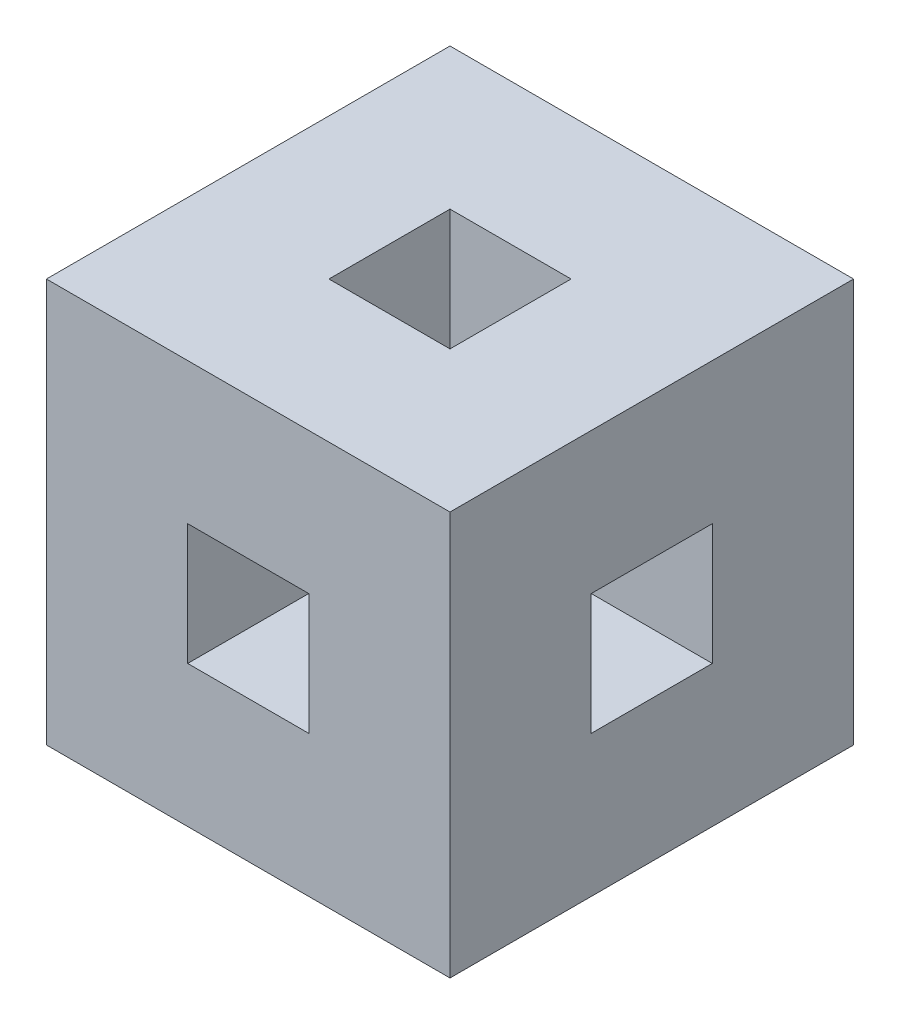
ISO-10303-21;
HEADER;
FILE_DESCRIPTION(('STEP AP214'),'2;1');
FILE_NAME('part.step','',(''),(''),'','','');
FILE_SCHEMA(('AUTOMOTIVE_DESIGN { 1 0 10303 214 1 1 1 1 }'));
ENDSEC;
DATA;
#1=APPLICATION_CONTEXT('core data for automotive mechanical design processes');
#2=APPLICATION_PROTOCOL_DEFINITION('international standard','automotive_design',2000,#1);
#3=PRODUCT_CONTEXT('',#1,'mechanical');
#4=PRODUCT('Part','Part','',(#3));
#5=PRODUCT_RELATED_PRODUCT_CATEGORY('part','',(#4));
#6=PRODUCT_DEFINITION_FORMATION('','',#4);
#7=PRODUCT_DEFINITION_CONTEXT('part definition',#1,'design');
#8=PRODUCT_DEFINITION('design','',#6,#7);
#9=PRODUCT_DEFINITION_SHAPE('','',#8);
#10=(LENGTH_UNIT() NAMED_UNIT(*) SI_UNIT(.MILLI.,.METRE.));
#11=(NAMED_UNIT(*) PLANE_ANGLE_UNIT() SI_UNIT($,.RADIAN.));
#12=(NAMED_UNIT(*) SI_UNIT($,.STERADIAN.) SOLID_ANGLE_UNIT());
#13=UNCERTAINTY_MEASURE_WITH_UNIT(LENGTH_MEASURE(1.E-05),#10,'distance_accuracy_value','');
#14=(GEOMETRIC_REPRESENTATION_CONTEXT(3) GLOBAL_UNCERTAINTY_ASSIGNED_CONTEXT((#13)) GLOBAL_UNIT_ASSIGNED_CONTEXT((#10,
#11,#12)) REPRESENTATION_CONTEXT('',''));
#15=CARTESIAN_POINT('',(0.,0.,0.));
#16=DIRECTION('',(0.,0.,1.));
#17=DIRECTION('',(1.,0.,0.));
#18=AXIS2_PLACEMENT_3D('',#15,#16,#17);
#19=CARTESIAN_POINT('',(0.,50.,0.));
#20=DIRECTION('',(0.,-1.,0.));
#21=DIRECTION('',(0.,0.,-1.));
#22=AXIS2_PLACEMENT_3D('',#19,#20,#21);
#23=PLANE('',#22);
#24=DIRECTION('',(0.,0.,-1.));
#25=VECTOR('',#24,1.);
#26=CARTESIAN_POINT('',(25.,50.,25.));
#27=LINE('',#26,#25);
#28=CARTESIAN_POINT('',(25.,50.,25.));
#29=VERTEX_POINT('',#28);
#30=CARTESIAN_POINT('',(25.,50.,-25.));
#31=VERTEX_POINT('',#30);
#32=EDGE_CURVE('E365',#29,#31,#27,.T.);
#33=ORIENTED_EDGE('',*,*,#32,.T.);
#34=DIRECTION('',(-1.,0.,0.));
#35=VECTOR('',#34,1.);
#36=CARTESIAN_POINT('',(-25.,50.,-25.));
#37=LINE('',#36,#35);
#38=CARTESIAN_POINT('',(-25.,50.,-25.));
#39=VERTEX_POINT('',#38);
#40=EDGE_CURVE('E366',#31,#39,#37,.T.);
#41=ORIENTED_EDGE('',*,*,#40,.T.);
#42=DIRECTION('',(0.,0.,1.));
#43=VECTOR('',#42,1.);
#44=CARTESIAN_POINT('',(-25.,50.,25.));
#45=LINE('',#44,#43);
#46=CARTESIAN_POINT('',(-25.,50.,25.));
#47=VERTEX_POINT('',#46);
#48=EDGE_CURVE('E375',#39,#47,#45,.T.);
#49=ORIENTED_EDGE('',*,*,#48,.T.);
#50=DIRECTION('',(1.,0.,0.));
#51=VECTOR('',#50,1.);
#52=CARTESIAN_POINT('',(-25.,50.,25.));
#53=LINE('',#52,#51);
#54=EDGE_CURVE('E374',#47,#29,#53,.T.);
#55=ORIENTED_EDGE('',*,*,#54,.T.);
#56=EDGE_LOOP('',(#33,#41,#49,#55));
#57=FACE_BOUND('',#56,.T.);
#58=DIRECTION('',(0.,0.,-1.));
#59=VECTOR('',#58,1.);
#60=CARTESIAN_POINT('',(-7.49999999999999,50.,7.49999999999982));
#61=LINE('',#60,#59);
#62=CARTESIAN_POINT('',(-7.49999999999999,50.,7.49999999999982));
#63=VERTEX_POINT('',#62);
#64=CARTESIAN_POINT('',(-7.49999999999999,50.,-7.50000000000018));
#65=VERTEX_POINT('',#64);
#66=EDGE_CURVE('E62',#63,#65,#61,.T.);
#67=ORIENTED_EDGE('',*,*,#66,.T.);
#68=DIRECTION('',(1.,0.,0.));
#69=VECTOR('',#68,1.);
#70=CARTESIAN_POINT('',(-7.49999999999999,50.,-7.50000000000018));
#71=LINE('',#70,#69);
#72=CARTESIAN_POINT('',(7.50000000000001,50.,-7.50000000000018));
#73=VERTEX_POINT('',#72);
#74=EDGE_CURVE('E219',#65,#73,#71,.T.);
#75=ORIENTED_EDGE('',*,*,#74,.T.);
#76=DIRECTION('',(0.,0.,-1.));
#77=VECTOR('',#76,1.);
#78=CARTESIAN_POINT('',(7.50000000000001,50.,7.49999999999982));
#79=LINE('',#78,#77);
#80=CARTESIAN_POINT('',(7.50000000000001,50.,7.49999999999982));
#81=VERTEX_POINT('',#80);
#82=EDGE_CURVE('E221',#81,#73,#79,.T.);
#83=ORIENTED_EDGE('',*,*,#82,.F.);
#84=DIRECTION('',(1.,0.,0.));
#85=VECTOR('',#84,1.);
#86=CARTESIAN_POINT('',(-7.49999999999999,50.,7.49999999999982));
#87=LINE('',#86,#85);
#88=EDGE_CURVE('E196',#63,#81,#87,.T.);
#89=ORIENTED_EDGE('',*,*,#88,.F.);
#90=EDGE_LOOP('',(#67,#75,#83,#89));
#91=FACE_BOUND('',#90,.T.);
#92=ADVANCED_FACE('F44',(#57,#91),#23,.F.);
#93=CARTESIAN_POINT('',(0.,0.,0.));
#94=DIRECTION('',(0.,-1.,0.));
#95=DIRECTION('',(0.,0.,-1.));
#96=AXIS2_PLACEMENT_3D('',#93,#94,#95);
#97=PLANE('',#96);
#98=DIRECTION('',(0.,0.,-1.));
#99=VECTOR('',#98,1.);
#100=CARTESIAN_POINT('',(25.,0.,25.));
#101=LINE('',#100,#99);
#102=CARTESIAN_POINT('',(25.,0.,25.));
#103=VERTEX_POINT('',#102);
#104=CARTESIAN_POINT('',(25.,0.,-25.));
#105=VERTEX_POINT('',#104);
#106=EDGE_CURVE('E361',#103,#105,#101,.T.);
#107=ORIENTED_EDGE('',*,*,#106,.F.);
#108=DIRECTION('',(1.,0.,0.));
#109=VECTOR('',#108,1.);
#110=CARTESIAN_POINT('',(-25.,0.,25.));
#111=LINE('',#110,#109);
#112=CARTESIAN_POINT('',(-25.,0.,25.));
#113=VERTEX_POINT('',#112);
#114=EDGE_CURVE('E369',#113,#103,#111,.T.);
#115=ORIENTED_EDGE('',*,*,#114,.F.);
#116=DIRECTION('',(0.,0.,1.));
#117=VECTOR('',#116,1.);
#118=CARTESIAN_POINT('',(-25.,0.,25.));
#119=LINE('',#118,#117);
#120=CARTESIAN_POINT('',(-25.,0.,-25.));
#121=VERTEX_POINT('',#120);
#122=EDGE_CURVE('E384',#121,#113,#119,.T.);
#123=ORIENTED_EDGE('',*,*,#122,.F.);
#124=DIRECTION('',(-1.,0.,0.));
#125=VECTOR('',#124,1.);
#126=CARTESIAN_POINT('',(-25.,0.,-25.));
#127=LINE('',#126,#125);
#128=EDGE_CURVE('E385',#105,#121,#127,.T.);
#129=ORIENTED_EDGE('',*,*,#128,.F.);
#130=EDGE_LOOP('',(#107,#115,#123,#129));
#131=FACE_BOUND('',#130,.T.);
#132=DIRECTION('',(1.,0.,0.));
#133=VECTOR('',#132,1.);
#134=CARTESIAN_POINT('',(-7.49999999999999,0.,-7.50000000000018));
#135=LINE('',#134,#133);
#136=CARTESIAN_POINT('',(-7.49999999999999,0.,-7.50000000000018));
#137=VERTEX_POINT('',#136);
#138=CARTESIAN_POINT('',(7.50000000000001,0.,-7.50000000000018));
#139=VERTEX_POINT('',#138);
#140=EDGE_CURVE('E197',#137,#139,#135,.T.);
#141=ORIENTED_EDGE('',*,*,#140,.F.);
#142=DIRECTION('',(0.,0.,-1.));
#143=VECTOR('',#142,1.);
#144=CARTESIAN_POINT('',(-7.49999999999999,0.,7.49999999999982));
#145=LINE('',#144,#143);
#146=CARTESIAN_POINT('',(-7.49999999999999,0.,7.49999999999982));
#147=VERTEX_POINT('',#146);
#148=EDGE_CURVE('E187',#147,#137,#145,.T.);
#149=ORIENTED_EDGE('',*,*,#148,.F.);
#150=DIRECTION('',(1.,0.,0.));
#151=VECTOR('',#150,1.);
#152=CARTESIAN_POINT('',(-7.49999999999999,0.,7.49999999999982));
#153=LINE('',#152,#151);
#154=CARTESIAN_POINT('',(7.50000000000001,0.,7.49999999999982));
#155=VERTEX_POINT('',#154);
#156=EDGE_CURVE('E215',#147,#155,#153,.T.);
#157=ORIENTED_EDGE('',*,*,#156,.T.);
#158=DIRECTION('',(0.,0.,-1.));
#159=VECTOR('',#158,1.);
#160=CARTESIAN_POINT('',(7.50000000000001,0.,7.49999999999982));
#161=LINE('',#160,#159);
#162=EDGE_CURVE('E66',#155,#139,#161,.T.);
#163=ORIENTED_EDGE('',*,*,#162,.T.);
#164=EDGE_LOOP('',(#141,#149,#157,#163));
#165=FACE_BOUND('',#164,.T.);
#166=ADVANCED_FACE('F208',(#131,#165),#97,.T.);
#167=CARTESIAN_POINT('',(-7.49999999999999,32.5,-25.));
#168=DIRECTION('',(0.,-1.,0.));
#169=DIRECTION('',(0.,0.,-1.));
#170=AXIS2_PLACEMENT_3D('',#167,#168,#169);
#171=PLANE('',#170);
#172=DIRECTION('',(1.,0.,0.));
#173=VECTOR('',#172,1.);
#174=CARTESIAN_POINT('',(-25.,32.5,-7.5));
#175=LINE('',#174,#173);
#176=CARTESIAN_POINT('',(-25.,32.5,-7.5));
#177=VERTEX_POINT('',#176);
#178=CARTESIAN_POINT('',(-7.49999999999999,32.5,-7.50000000000018));
#179=VERTEX_POINT('',#178);
#180=EDGE_CURVE('E297',#177,#179,#175,.T.);
#181=ORIENTED_EDGE('',*,*,#180,.T.);
#182=DIRECTION('',(0.,0.,1.));
#183=VECTOR('',#182,1.);
#184=CARTESIAN_POINT('',(-7.49999999999999,32.5,-25.));
#185=LINE('',#184,#183);
#186=CARTESIAN_POINT('',(-7.49999999999999,32.5,7.49999999999982));
#187=VERTEX_POINT('',#186);
#188=EDGE_CURVE('E253',#179,#187,#185,.T.);
#189=ORIENTED_EDGE('',*,*,#188,.T.);
#190=DIRECTION('',(1.,0.,0.));
#191=VECTOR('',#190,1.);
#192=CARTESIAN_POINT('',(-25.,32.5,7.5));
#193=LINE('',#192,#191);
#194=CARTESIAN_POINT('',(-25.,32.5,7.5));
#195=VERTEX_POINT('',#194);
#196=EDGE_CURVE('E302',#195,#187,#193,.T.);
#197=ORIENTED_EDGE('',*,*,#196,.F.);
#198=DIRECTION('',(0.,0.,-1.));
#199=VECTOR('',#198,1.);
#200=CARTESIAN_POINT('',(-25.,32.5,7.5));
#201=LINE('',#200,#199);
#202=EDGE_CURVE('E259',#195,#177,#201,.T.);
#203=ORIENTED_EDGE('',*,*,#202,.T.);
#204=EDGE_LOOP('',(#181,#189,#197,#203));
#205=FACE_BOUND('',#204,.T.);
#206=ADVANCED_FACE('F483',(#205),#171,.T.);
#207=DIRECTION('',(0.,0.,1.));
#208=VECTOR('',#207,1.);
#209=CARTESIAN_POINT('',(7.50000000000001,32.5,-25.));
#210=LINE('',#209,#208);
#211=CARTESIAN_POINT('',(7.50000000000001,32.5,-25.));
#212=VERTEX_POINT('',#211);
#213=CARTESIAN_POINT('',(7.50000000000001,32.5,-7.50000000000018));
#214=VERTEX_POINT('',#213);
#215=EDGE_CURVE('E356',#212,#214,#210,.T.);
#216=ORIENTED_EDGE('',*,*,#215,.T.);
#217=DIRECTION('',(-1.,0.,0.));
#218=VECTOR('',#217,1.);
#219=CARTESIAN_POINT('',(-7.49999999999999,32.5,-7.50000000000018));
#220=LINE('',#219,#218);
#221=EDGE_CURVE('E249',#214,#179,#220,.T.);
#222=ORIENTED_EDGE('',*,*,#221,.T.);
#223=DIRECTION('',(0.,0.,1.));
#224=VECTOR('',#223,1.);
#225=CARTESIAN_POINT('',(-7.49999999999999,32.5,-25.));
#226=LINE('',#225,#224);
#227=CARTESIAN_POINT('',(-7.49999999999999,32.5,-25.));
#228=VERTEX_POINT('',#227);
#229=EDGE_CURVE('E341',#228,#179,#226,.T.);
#230=ORIENTED_EDGE('',*,*,#229,.F.);
#231=DIRECTION('',(1.,0.,0.));
#232=VECTOR('',#231,1.);
#233=CARTESIAN_POINT('',(-7.49999999999999,32.5,-25.));
#234=LINE('',#233,#232);
#235=EDGE_CURVE('E314',#228,#212,#234,.T.);
#236=ORIENTED_EDGE('',*,*,#235,.T.);
#237=EDGE_LOOP('',(#216,#222,#230,#236));
#238=FACE_BOUND('',#237,.T.);
#239=ADVANCED_FACE('F491',(#238),#171,.T.);
#240=DIRECTION('',(0.,0.,1.));
#241=VECTOR('',#240,1.);
#242=CARTESIAN_POINT('',(7.50000000000001,32.5,-25.));
#243=LINE('',#242,#241);
#244=CARTESIAN_POINT('',(7.50000000000001,32.5,7.5));
#245=VERTEX_POINT('',#244);
#246=EDGE_CURVE('E244',#214,#245,#243,.T.);
#247=ORIENTED_EDGE('',*,*,#246,.F.);
#248=CARTESIAN_POINT('',(25.,32.5,-7.5));
#249=VERTEX_POINT('',#248);
#250=EDGE_CURVE('E293',#214,#249,#175,.T.);
#251=ORIENTED_EDGE('',*,*,#250,.T.);
#252=DIRECTION('',(0.,0.,-1.));
#253=VECTOR('',#252,1.);
#254=CARTESIAN_POINT('',(25.,32.5,7.5));
#255=LINE('',#254,#253);
#256=CARTESIAN_POINT('',(25.,32.5,7.5));
#257=VERTEX_POINT('',#256);
#258=EDGE_CURVE('E274',#257,#249,#255,.T.);
#259=ORIENTED_EDGE('',*,*,#258,.F.);
#260=EDGE_CURVE('E298',#245,#257,#193,.T.);
#261=ORIENTED_EDGE('',*,*,#260,.F.);
#262=EDGE_LOOP('',(#247,#251,#259,#261));
#263=FACE_BOUND('',#262,.T.);
#264=ADVANCED_FACE('F458',(#263),#171,.T.);
#265=CARTESIAN_POINT('',(-7.49999999999999,17.5,-25.));
#266=DIRECTION('',(0.,-1.,0.));
#267=DIRECTION('',(0.,0.,-1.));
#268=AXIS2_PLACEMENT_3D('',#265,#266,#267);
#269=PLANE('',#268);
#270=DIRECTION('',(0.,0.,1.));
#271=VECTOR('',#270,1.);
#272=CARTESIAN_POINT('',(-7.49999999999999,17.5,-25.));
#273=LINE('',#272,#271);
#274=CARTESIAN_POINT('',(-7.49999999999999,17.5,-7.50000000000018));
#275=VERTEX_POINT('',#274);
#276=CARTESIAN_POINT('',(-7.49999999999999,17.5,7.5));
#277=VERTEX_POINT('',#276);
#278=EDGE_CURVE('E11',#275,#277,#273,.T.);
#279=ORIENTED_EDGE('',*,*,#278,.F.);
#280=DIRECTION('',(1.,0.,0.));
#281=VECTOR('',#280,1.);
#282=CARTESIAN_POINT('',(-25.,17.5,-7.5));
#283=LINE('',#282,#281);
#284=CARTESIAN_POINT('',(-25.,17.5,-7.5));
#285=VERTEX_POINT('',#284);
#286=EDGE_CURVE('E292',#285,#275,#283,.T.);
#287=ORIENTED_EDGE('',*,*,#286,.F.);
#288=DIRECTION('',(0.,0.,-1.));
#289=VECTOR('',#288,1.);
#290=CARTESIAN_POINT('',(-25.,17.5,7.5));
#291=LINE('',#290,#289);
#292=CARTESIAN_POINT('',(-25.,17.5,7.5));
#293=VERTEX_POINT('',#292);
#294=EDGE_CURVE('E270',#293,#285,#291,.T.);
#295=ORIENTED_EDGE('',*,*,#294,.F.);
#296=DIRECTION('',(1.,0.,0.));
#297=VECTOR('',#296,1.);
#298=CARTESIAN_POINT('',(-25.,17.5,7.5));
#299=LINE('',#298,#297);
#300=EDGE_CURVE('E287',#293,#277,#299,.T.);
#301=ORIENTED_EDGE('',*,*,#300,.T.);
#302=EDGE_LOOP('',(#279,#287,#295,#301));
#303=FACE_BOUND('',#302,.T.);
#304=ADVANCED_FACE('F478',(#303),#269,.F.);
#305=DIRECTION('',(-1.,0.,0.));
#306=VECTOR('',#305,1.);
#307=CARTESIAN_POINT('',(-7.49999999999999,17.5,-7.50000000000018));
#308=LINE('',#307,#306);
#309=CARTESIAN_POINT('',(7.50000000000001,17.5,-7.50000000000018));
#310=VERTEX_POINT('',#309);
#311=EDGE_CURVE('E53',#310,#275,#308,.T.);
#312=ORIENTED_EDGE('',*,*,#311,.F.);
#313=DIRECTION('',(0.,0.,1.));
#314=VECTOR('',#313,1.);
#315=CARTESIAN_POINT('',(7.50000000000001,17.5,-25.));
#316=LINE('',#315,#314);
#317=CARTESIAN_POINT('',(7.50000000000001,17.5,-25.));
#318=VERTEX_POINT('',#317);
#319=EDGE_CURVE('E351',#318,#310,#316,.T.);
#320=ORIENTED_EDGE('',*,*,#319,.F.);
#321=DIRECTION('',(1.,0.,0.));
#322=VECTOR('',#321,1.);
#323=CARTESIAN_POINT('',(-7.49999999999999,17.5,-25.));
#324=LINE('',#323,#322);
#325=CARTESIAN_POINT('',(-7.49999999999999,17.5,-25.));
#326=VERTEX_POINT('',#325);
#327=EDGE_CURVE('E325',#326,#318,#324,.T.);
#328=ORIENTED_EDGE('',*,*,#327,.F.);
#329=DIRECTION('',(0.,0.,1.));
#330=VECTOR('',#329,1.);
#331=CARTESIAN_POINT('',(-7.49999999999999,17.5,-25.));
#332=LINE('',#331,#330);
#333=EDGE_CURVE('E349',#326,#275,#332,.T.);
#334=ORIENTED_EDGE('',*,*,#333,.T.);
#335=EDGE_LOOP('',(#312,#320,#328,#334));
#336=FACE_BOUND('',#335,.T.);
#337=ADVANCED_FACE('F505',(#336),#269,.F.);
#338=CARTESIAN_POINT('',(25.,17.5,-7.5));
#339=VERTEX_POINT('',#338);
#340=EDGE_CURVE('E288',#310,#339,#283,.T.);
#341=ORIENTED_EDGE('',*,*,#340,.F.);
#342=DIRECTION('',(0.,0.,1.));
#343=VECTOR('',#342,1.);
#344=CARTESIAN_POINT('',(7.50000000000001,17.5,-25.));
#345=LINE('',#344,#343);
#346=CARTESIAN_POINT('',(7.50000000000001,17.5,7.49999999999982));
#347=VERTEX_POINT('',#346);
#348=EDGE_CURVE('E417',#310,#347,#345,.T.);
#349=ORIENTED_EDGE('',*,*,#348,.T.);
#350=CARTESIAN_POINT('',(25.,17.5,7.5));
#351=VERTEX_POINT('',#350);
#352=EDGE_CURVE('E271',#347,#351,#299,.T.);
#353=ORIENTED_EDGE('',*,*,#352,.T.);
#354=DIRECTION('',(0.,0.,-1.));
#355=VECTOR('',#354,1.);
#356=CARTESIAN_POINT('',(25.,17.5,7.5));
#357=LINE('',#356,#355);
#358=EDGE_CURVE('E257',#351,#339,#357,.T.);
#359=ORIENTED_EDGE('',*,*,#358,.T.);
#360=EDGE_LOOP('',(#341,#349,#353,#359));
#361=FACE_BOUND('',#360,.T.);
#362=ADVANCED_FACE('F511',(#361),#269,.F.);
#363=CARTESIAN_POINT('',(25.,50.,25.));
#364=DIRECTION('',(-1.,0.,0.));
#365=DIRECTION('',(0.,0.,1.));
#366=AXIS2_PLACEMENT_3D('',#363,#364,#365);
#367=PLANE('',#366);
#368=ORIENTED_EDGE('',*,*,#106,.T.);
#369=DIRECTION('',(0.,-1.,0.));
#370=VECTOR('',#369,1.);
#371=CARTESIAN_POINT('',(25.,50.,-25.));
#372=LINE('',#371,#370);
#373=EDGE_CURVE('E402',#31,#105,#372,.T.);
#374=ORIENTED_EDGE('',*,*,#373,.F.);
#375=ORIENTED_EDGE('',*,*,#32,.F.);
#376=DIRECTION('',(0.,-1.,0.));
#377=VECTOR('',#376,1.);
#378=CARTESIAN_POINT('',(25.,50.,25.));
#379=LINE('',#378,#377);
#380=EDGE_CURVE('E378',#29,#103,#379,.T.);
#381=ORIENTED_EDGE('',*,*,#380,.T.);
#382=EDGE_LOOP('',(#368,#374,#375,#381));
#383=FACE_BOUND('',#382,.T.);
#384=DIRECTION('',(0.,1.,0.));
#385=VECTOR('',#384,1.);
#386=CARTESIAN_POINT('',(25.,17.5,7.5));
#387=LINE('',#386,#385);
#388=EDGE_CURVE('E254',#351,#257,#387,.T.);
#389=ORIENTED_EDGE('',*,*,#388,.T.);
#390=ORIENTED_EDGE('',*,*,#258,.T.);
#391=DIRECTION('',(0.,1.,0.));
#392=VECTOR('',#391,1.);
#393=CARTESIAN_POINT('',(25.,17.5,-7.5));
#394=LINE('',#393,#392);
#395=EDGE_CURVE('E276',#339,#249,#394,.T.);
#396=ORIENTED_EDGE('',*,*,#395,.F.);
#397=ORIENTED_EDGE('',*,*,#358,.F.);
#398=EDGE_LOOP('',(#389,#390,#396,#397));
#399=FACE_BOUND('',#398,.T.);
#400=ADVANCED_FACE('F50',(#383,#399),#367,.F.);
#401=CARTESIAN_POINT('',(-25.,50.,25.));
#402=DIRECTION('',(1.,0.,0.));
#403=DIRECTION('',(0.,0.,-1.));
#404=AXIS2_PLACEMENT_3D('',#401,#402,#403);
#405=PLANE('',#404);
#406=ORIENTED_EDGE('',*,*,#122,.T.);
#407=DIRECTION('',(0.,-1.,0.));
#408=VECTOR('',#407,1.);
#409=CARTESIAN_POINT('',(-25.,50.,25.));
#410=LINE('',#409,#408);
#411=EDGE_CURVE('E394',#47,#113,#410,.T.);
#412=ORIENTED_EDGE('',*,*,#411,.F.);
#413=ORIENTED_EDGE('',*,*,#48,.F.);
#414=DIRECTION('',(0.,-1.,0.));
#415=VECTOR('',#414,1.);
#416=CARTESIAN_POINT('',(-25.,50.,-25.));
#417=LINE('',#416,#415);
#418=EDGE_CURVE('E399',#39,#121,#417,.T.);
#419=ORIENTED_EDGE('',*,*,#418,.T.);
#420=EDGE_LOOP('',(#406,#412,#413,#419));
#421=FACE_BOUND('',#420,.T.);
#422=DIRECTION('',(0.,1.,0.));
#423=VECTOR('',#422,1.);
#424=CARTESIAN_POINT('',(-25.,17.5,7.5));
#425=LINE('',#424,#423);
#426=EDGE_CURVE('E258',#293,#195,#425,.T.);
#427=ORIENTED_EDGE('',*,*,#426,.F.);
#428=ORIENTED_EDGE('',*,*,#294,.T.);
#429=DIRECTION('',(0.,1.,0.));
#430=VECTOR('',#429,1.);
#431=CARTESIAN_POINT('',(-25.,17.5,-7.5));
#432=LINE('',#431,#430);
#433=EDGE_CURVE('E263',#285,#177,#432,.T.);
#434=ORIENTED_EDGE('',*,*,#433,.T.);
#435=ORIENTED_EDGE('',*,*,#202,.F.);
#436=EDGE_LOOP('',(#427,#428,#434,#435));
#437=FACE_BOUND('',#436,.T.);
#438=ADVANCED_FACE('F481',(#421,#437),#405,.F.);
#439=CARTESIAN_POINT('',(7.50000000000001,17.5,-25.));
#440=DIRECTION('',(1.,0.,0.));
#441=DIRECTION('',(0.,0.,-1.));
#442=AXIS2_PLACEMENT_3D('',#439,#440,#441);
#443=PLANE('',#442);
#444=DIRECTION('',(0.,1.,0.));
#445=VECTOR('',#444,1.);
#446=CARTESIAN_POINT('',(7.50000000000001,17.5,7.5));
#447=LINE('',#446,#445);
#448=EDGE_CURVE('E310',#347,#245,#447,.T.);
#449=ORIENTED_EDGE('',*,*,#448,.F.);
#450=CARTESIAN_POINT('',(7.50000000000001,17.5,25.));
#451=VERTEX_POINT('',#450);
#452=EDGE_CURVE('E354',#347,#451,#316,.T.);
#453=ORIENTED_EDGE('',*,*,#452,.T.);
#454=DIRECTION('',(0.,1.,0.));
#455=VECTOR('',#454,1.);
#456=CARTESIAN_POINT('',(7.50000000000001,17.5,25.));
#457=LINE('',#456,#455);
#458=CARTESIAN_POINT('',(7.50000000000001,32.5,25.));
#459=VERTEX_POINT('',#458);
#460=EDGE_CURVE('E334',#451,#459,#457,.T.);
#461=ORIENTED_EDGE('',*,*,#460,.T.);
#462=EDGE_CURVE('E360',#245,#459,#210,.T.);
#463=ORIENTED_EDGE('',*,*,#462,.F.);
#464=EDGE_LOOP('',(#449,#453,#461,#463));
#465=FACE_BOUND('',#464,.T.);
#466=ADVANCED_FACE('F462',(#465),#443,.F.);
#467=CARTESIAN_POINT('',(-7.49999999999999,17.5,-25.));
#468=DIRECTION('',(1.,0.,0.));
#469=DIRECTION('',(0.,0.,-1.));
#470=AXIS2_PLACEMENT_3D('',#467,#468,#469);
#471=PLANE('',#470);
#472=CARTESIAN_POINT('',(-7.49999999999999,17.5,25.));
#473=VERTEX_POINT('',#472);
#474=EDGE_CURVE('E346',#277,#473,#332,.T.);
#475=ORIENTED_EDGE('',*,*,#474,.F.);
#476=DIRECTION('',(0.,1.,0.));
#477=VECTOR('',#476,1.);
#478=CARTESIAN_POINT('',(-7.49999999999999,17.5,7.5));
#479=LINE('',#478,#477);
#480=EDGE_CURVE('E406',#277,#187,#479,.T.);
#481=ORIENTED_EDGE('',*,*,#480,.T.);
#482=CARTESIAN_POINT('',(-7.49999999999999,32.5,25.));
#483=VERTEX_POINT('',#482);
#484=EDGE_CURVE('E328',#187,#483,#226,.T.);
#485=ORIENTED_EDGE('',*,*,#484,.T.);
#486=DIRECTION('',(0.,1.,0.));
#487=VECTOR('',#486,1.);
#488=CARTESIAN_POINT('',(-7.49999999999999,17.5,25.));
#489=LINE('',#488,#487);
#490=EDGE_CURVE('E318',#473,#483,#489,.T.);
#491=ORIENTED_EDGE('',*,*,#490,.F.);
#492=EDGE_LOOP('',(#475,#481,#485,#491));
#493=FACE_BOUND('',#492,.T.);
#494=ADVANCED_FACE('F466',(#493),#471,.T.);
#495=CARTESIAN_POINT('',(-25.,50.,-25.));
#496=DIRECTION('',(0.,0.,1.));
#497=DIRECTION('',(1.,0.,0.));
#498=AXIS2_PLACEMENT_3D('',#495,#496,#497);
#499=PLANE('',#498);
#500=ORIENTED_EDGE('',*,*,#128,.T.);
#501=ORIENTED_EDGE('',*,*,#418,.F.);
#502=ORIENTED_EDGE('',*,*,#40,.F.);
#503=ORIENTED_EDGE('',*,*,#373,.T.);
#504=EDGE_LOOP('',(#500,#501,#502,#503));
#505=FACE_BOUND('',#504,.T.);
#506=ORIENTED_EDGE('',*,*,#235,.F.);
#507=DIRECTION('',(0.,1.,0.));
#508=VECTOR('',#507,1.);
#509=CARTESIAN_POINT('',(-7.49999999999999,17.5,-25.));
#510=LINE('',#509,#508);
#511=EDGE_CURVE('E326',#326,#228,#510,.T.);
#512=ORIENTED_EDGE('',*,*,#511,.F.);
#513=ORIENTED_EDGE('',*,*,#327,.T.);
#514=DIRECTION('',(0.,1.,0.));
#515=VECTOR('',#514,1.);
#516=CARTESIAN_POINT('',(7.50000000000001,17.5,-25.));
#517=LINE('',#516,#515);
#518=EDGE_CURVE('E320',#318,#212,#517,.T.);
#519=ORIENTED_EDGE('',*,*,#518,.T.);
#520=EDGE_LOOP('',(#506,#512,#513,#519));
#521=FACE_BOUND('',#520,.T.);
#522=ADVANCED_FACE('F507',(#505,#521),#499,.F.);
#523=CARTESIAN_POINT('',(-25.,50.,25.));
#524=DIRECTION('',(0.,0.,-1.));
#525=DIRECTION('',(-1.,0.,0.));
#526=AXIS2_PLACEMENT_3D('',#523,#524,#525);
#527=PLANE('',#526);
#528=ORIENTED_EDGE('',*,*,#114,.T.);
#529=ORIENTED_EDGE('',*,*,#380,.F.);
#530=ORIENTED_EDGE('',*,*,#54,.F.);
#531=ORIENTED_EDGE('',*,*,#411,.T.);
#532=EDGE_LOOP('',(#528,#529,#530,#531));
#533=FACE_BOUND('',#532,.T.);
#534=DIRECTION('',(1.,0.,0.));
#535=VECTOR('',#534,1.);
#536=CARTESIAN_POINT('',(-7.49999999999999,32.5,25.));
#537=LINE('',#536,#535);
#538=EDGE_CURVE('E311',#483,#459,#537,.T.);
#539=ORIENTED_EDGE('',*,*,#538,.T.);
#540=ORIENTED_EDGE('',*,*,#460,.F.);
#541=DIRECTION('',(1.,0.,0.));
#542=VECTOR('',#541,1.);
#543=CARTESIAN_POINT('',(-7.49999999999999,17.5,25.));
#544=LINE('',#543,#542);
#545=EDGE_CURVE('E340',#473,#451,#544,.T.);
#546=ORIENTED_EDGE('',*,*,#545,.F.);
#547=ORIENTED_EDGE('',*,*,#490,.T.);
#548=EDGE_LOOP('',(#539,#540,#546,#547));
#549=FACE_BOUND('',#548,.T.);
#550=ADVANCED_FACE('F463',(#533,#549),#527,.F.);
#551=DIRECTION('',(-1.,0.,0.));
#552=VECTOR('',#551,1.);
#553=CARTESIAN_POINT('',(-7.49999999999999,32.5,7.49999999999982));
#554=LINE('',#553,#552);
#555=EDGE_CURVE('E202',#245,#187,#554,.T.);
#556=ORIENTED_EDGE('',*,*,#555,.F.);
#557=ORIENTED_EDGE('',*,*,#462,.T.);
#558=ORIENTED_EDGE('',*,*,#538,.F.);
#559=ORIENTED_EDGE('',*,*,#484,.F.);
#560=EDGE_LOOP('',(#556,#557,#558,#559));
#561=FACE_BOUND('',#560,.T.);
#562=ADVANCED_FACE('F448',(#561),#171,.T.);
#563=ORIENTED_EDGE('',*,*,#319,.T.);
#564=DIRECTION('',(0.,1.,0.));
#565=VECTOR('',#564,1.);
#566=CARTESIAN_POINT('',(7.50000000000001,17.5,-7.5));
#567=LINE('',#566,#565);
#568=EDGE_CURVE('E303',#310,#214,#567,.T.);
#569=ORIENTED_EDGE('',*,*,#568,.T.);
#570=ORIENTED_EDGE('',*,*,#215,.F.);
#571=ORIENTED_EDGE('',*,*,#518,.F.);
#572=EDGE_LOOP('',(#563,#569,#570,#571));
#573=FACE_BOUND('',#572,.T.);
#574=ADVANCED_FACE('F510',(#573),#443,.F.);
#575=ORIENTED_EDGE('',*,*,#452,.F.);
#576=DIRECTION('',(-1.,0.,0.));
#577=VECTOR('',#576,1.);
#578=CARTESIAN_POINT('',(-7.49999999999999,17.5,7.49999999999982));
#579=LINE('',#578,#577);
#580=EDGE_CURVE('E415',#347,#277,#579,.T.);
#581=ORIENTED_EDGE('',*,*,#580,.T.);
#582=ORIENTED_EDGE('',*,*,#474,.T.);
#583=ORIENTED_EDGE('',*,*,#545,.T.);
#584=EDGE_LOOP('',(#575,#581,#582,#583));
#585=FACE_BOUND('',#584,.T.);
#586=ADVANCED_FACE('F527',(#585),#269,.F.);
#587=DIRECTION('',(0.,1.,0.));
#588=VECTOR('',#587,1.);
#589=CARTESIAN_POINT('',(-7.49999999999999,17.5,-7.5));
#590=LINE('',#589,#588);
#591=EDGE_CURVE('E403',#275,#179,#590,.T.);
#592=ORIENTED_EDGE('',*,*,#591,.F.);
#593=ORIENTED_EDGE('',*,*,#333,.F.);
#594=ORIENTED_EDGE('',*,*,#511,.T.);
#595=ORIENTED_EDGE('',*,*,#229,.T.);
#596=EDGE_LOOP('',(#592,#593,#594,#595));
#597=FACE_BOUND('',#596,.T.);
#598=ADVANCED_FACE('F496',(#597),#471,.T.);
#599=CARTESIAN_POINT('',(-25.,17.5,7.5));
#600=DIRECTION('',(0.,0.,-1.));
#601=DIRECTION('',(-1.,0.,0.));
#602=AXIS2_PLACEMENT_3D('',#599,#600,#601);
#603=PLANE('',#602);
#604=ORIENTED_EDGE('',*,*,#300,.F.);
#605=ORIENTED_EDGE('',*,*,#426,.T.);
#606=ORIENTED_EDGE('',*,*,#196,.T.);
#607=ORIENTED_EDGE('',*,*,#480,.F.);
#608=EDGE_LOOP('',(#604,#605,#606,#607));
#609=FACE_BOUND('',#608,.T.);
#610=ADVANCED_FACE('F472',(#609),#603,.T.);
#611=CARTESIAN_POINT('',(-25.,17.5,-7.5));
#612=DIRECTION('',(0.,0.,-1.));
#613=DIRECTION('',(-1.,0.,0.));
#614=AXIS2_PLACEMENT_3D('',#611,#612,#613);
#615=PLANE('',#614);
#616=ORIENTED_EDGE('',*,*,#591,.T.);
#617=ORIENTED_EDGE('',*,*,#180,.F.);
#618=ORIENTED_EDGE('',*,*,#433,.F.);
#619=ORIENTED_EDGE('',*,*,#286,.T.);
#620=EDGE_LOOP('',(#616,#617,#618,#619));
#621=FACE_BOUND('',#620,.T.);
#622=ADVANCED_FACE('F497',(#621),#615,.F.);
#623=ORIENTED_EDGE('',*,*,#448,.T.);
#624=ORIENTED_EDGE('',*,*,#260,.T.);
#625=ORIENTED_EDGE('',*,*,#388,.F.);
#626=ORIENTED_EDGE('',*,*,#352,.F.);
#627=EDGE_LOOP('',(#623,#624,#625,#626));
#628=FACE_BOUND('',#627,.T.);
#629=ADVANCED_FACE('F457',(#628),#603,.T.);
#630=ORIENTED_EDGE('',*,*,#340,.T.);
#631=ORIENTED_EDGE('',*,*,#395,.T.);
#632=ORIENTED_EDGE('',*,*,#250,.F.);
#633=ORIENTED_EDGE('',*,*,#568,.F.);
#634=EDGE_LOOP('',(#630,#631,#632,#633));
#635=FACE_BOUND('',#634,.T.);
#636=ADVANCED_FACE('F512',(#635),#615,.F.);
#637=CARTESIAN_POINT('',(-7.49999999999999,0.,7.49999999999982));
#638=DIRECTION('',(0.,0.,1.));
#639=DIRECTION('',(1.,0.,0.));
#640=AXIS2_PLACEMENT_3D('',#637,#638,#639);
#641=PLANE('',#640);
#642=DIRECTION('',(0.,1.,0.));
#643=VECTOR('',#642,1.);
#644=CARTESIAN_POINT('',(7.50000000000001,0.,7.49999999999982));
#645=LINE('',#644,#643);
#646=EDGE_CURVE('E231',#155,#347,#645,.T.);
#647=ORIENTED_EDGE('',*,*,#646,.F.);
#648=ORIENTED_EDGE('',*,*,#156,.F.);
#649=DIRECTION('',(0.,1.,0.));
#650=VECTOR('',#649,1.);
#651=CARTESIAN_POINT('',(-7.49999999999999,0.,7.49999999999982));
#652=LINE('',#651,#650);
#653=EDGE_CURVE('E192',#147,#277,#652,.T.);
#654=ORIENTED_EDGE('',*,*,#653,.T.);
#655=ORIENTED_EDGE('',*,*,#580,.F.);
#656=EDGE_LOOP('',(#647,#648,#654,#655));
#657=FACE_BOUND('',#656,.T.);
#658=ADVANCED_FACE('F624',(#657),#641,.F.);
#659=CARTESIAN_POINT('',(7.50000000000001,0.,7.49999999999982));
#660=DIRECTION('',(1.,0.,0.));
#661=DIRECTION('',(0.,0.,-1.));
#662=AXIS2_PLACEMENT_3D('',#659,#660,#661);
#663=PLANE('',#662);
#664=DIRECTION('',(0.,1.,0.));
#665=VECTOR('',#664,1.);
#666=CARTESIAN_POINT('',(7.50000000000001,0.,-7.50000000000018));
#667=LINE('',#666,#665);
#668=EDGE_CURVE('E236',#139,#310,#667,.T.);
#669=ORIENTED_EDGE('',*,*,#668,.F.);
#670=ORIENTED_EDGE('',*,*,#162,.F.);
#671=ORIENTED_EDGE('',*,*,#646,.T.);
#672=ORIENTED_EDGE('',*,*,#348,.F.);
#673=EDGE_LOOP('',(#669,#670,#671,#672));
#674=FACE_BOUND('',#673,.T.);
#675=ADVANCED_FACE('F706',(#674),#663,.F.);
#676=CARTESIAN_POINT('',(-7.49999999999999,0.,-7.50000000000018));
#677=DIRECTION('',(0.,0.,1.));
#678=DIRECTION('',(1.,0.,0.));
#679=AXIS2_PLACEMENT_3D('',#676,#677,#678);
#680=PLANE('',#679);
#681=ORIENTED_EDGE('',*,*,#311,.T.);
#682=DIRECTION('',(0.,1.,0.));
#683=VECTOR('',#682,1.);
#684=CARTESIAN_POINT('',(-7.49999999999999,0.,-7.50000000000018));
#685=LINE('',#684,#683);
#686=EDGE_CURVE('E186',#137,#275,#685,.T.);
#687=ORIENTED_EDGE('',*,*,#686,.F.);
#688=ORIENTED_EDGE('',*,*,#140,.T.);
#689=ORIENTED_EDGE('',*,*,#668,.T.);
#690=EDGE_LOOP('',(#681,#687,#688,#689));
#691=FACE_BOUND('',#690,.T.);
#692=ADVANCED_FACE('F203',(#691),#680,.T.);
#693=CARTESIAN_POINT('',(-7.49999999999999,0.,7.49999999999982));
#694=DIRECTION('',(1.,0.,0.));
#695=DIRECTION('',(0.,0.,-1.));
#696=AXIS2_PLACEMENT_3D('',#693,#694,#695);
#697=PLANE('',#696);
#698=ORIENTED_EDGE('',*,*,#278,.T.);
#699=ORIENTED_EDGE('',*,*,#653,.F.);
#700=ORIENTED_EDGE('',*,*,#148,.T.);
#701=ORIENTED_EDGE('',*,*,#686,.T.);
#702=EDGE_LOOP('',(#698,#699,#700,#701));
#703=FACE_BOUND('',#702,.T.);
#704=ADVANCED_FACE('F189',(#703),#697,.T.);
#705=EDGE_CURVE('E206',#179,#65,#685,.T.);
#706=ORIENTED_EDGE('',*,*,#705,.T.);
#707=ORIENTED_EDGE('',*,*,#66,.F.);
#708=EDGE_CURVE('E220',#187,#63,#652,.T.);
#709=ORIENTED_EDGE('',*,*,#708,.F.);
#710=ORIENTED_EDGE('',*,*,#188,.F.);
#711=EDGE_LOOP('',(#706,#707,#709,#710));
#712=FACE_BOUND('',#711,.T.);
#713=ADVANCED_FACE('F486',(#712),#697,.T.);
#714=EDGE_CURVE('E240',#214,#73,#667,.T.);
#715=ORIENTED_EDGE('',*,*,#714,.T.);
#716=ORIENTED_EDGE('',*,*,#74,.F.);
#717=ORIENTED_EDGE('',*,*,#705,.F.);
#718=ORIENTED_EDGE('',*,*,#221,.F.);
#719=EDGE_LOOP('',(#715,#716,#717,#718));
#720=FACE_BOUND('',#719,.T.);
#721=ADVANCED_FACE('F488',(#720),#680,.T.);
#722=ORIENTED_EDGE('',*,*,#246,.T.);
#723=EDGE_CURVE('E235',#245,#81,#645,.T.);
#724=ORIENTED_EDGE('',*,*,#723,.T.);
#725=ORIENTED_EDGE('',*,*,#82,.T.);
#726=ORIENTED_EDGE('',*,*,#714,.F.);
#727=EDGE_LOOP('',(#722,#724,#725,#726));
#728=FACE_BOUND('',#727,.T.);
#729=ADVANCED_FACE('F444',(#728),#663,.F.);
#730=ORIENTED_EDGE('',*,*,#555,.T.);
#731=ORIENTED_EDGE('',*,*,#708,.T.);
#732=ORIENTED_EDGE('',*,*,#88,.T.);
#733=ORIENTED_EDGE('',*,*,#723,.F.);
#734=EDGE_LOOP('',(#730,#731,#732,#733));
#735=FACE_BOUND('',#734,.T.);
#736=ADVANCED_FACE('F436',(#735),#641,.F.);
#737=CLOSED_SHELL('',(#92,#166,#206,#239,#264,#304,#337,#362,#400,#438,#466,#494,#522,#550,#562,
#574,#586,#598,#610,#622,#629,#636,#658,#675,#692,#704,#713,#721,#729,#736));
#738=MANIFOLD_SOLID_BREP('B2',#737);
#739=ADVANCED_BREP_SHAPE_REPRESENTATION('',(#18,#738),#14);
#740=SHAPE_DEFINITION_REPRESENTATION(#9,#739);
ENDSEC;
END-ISO-10303-21;
